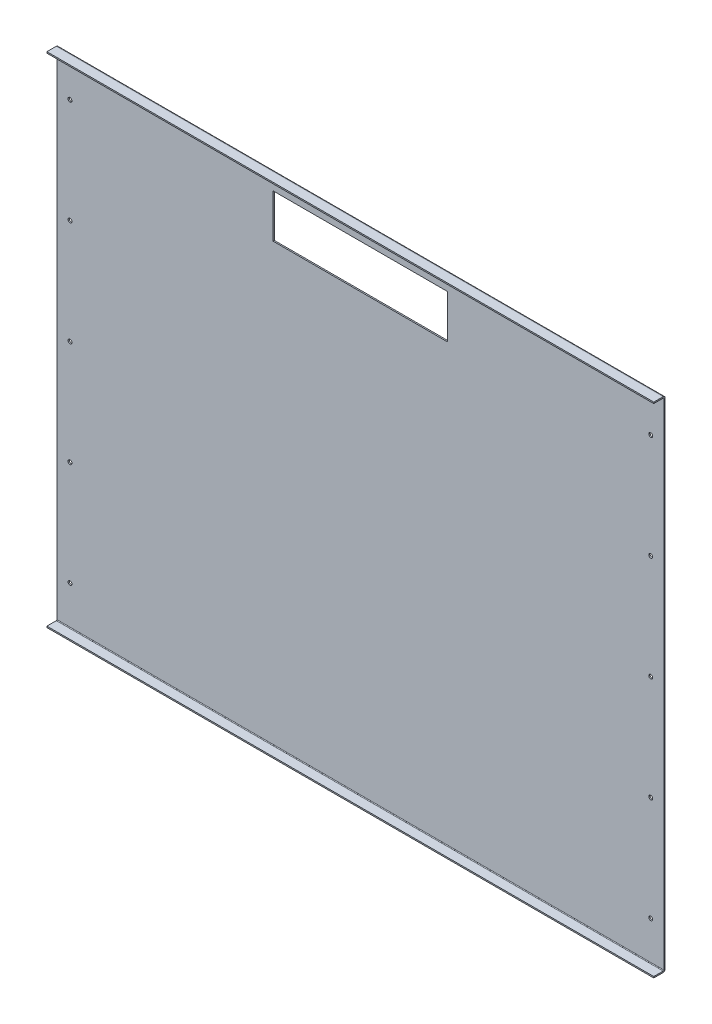
ISO-10303-21;
HEADER;
FILE_DESCRIPTION(('STEP AP214'),'2;1');
FILE_NAME('part.step','',(''),(''),'','','');
FILE_SCHEMA(('AUTOMOTIVE_DESIGN { 1 0 10303 214 1 1 1 1 }'));
ENDSEC;
DATA;
#1=APPLICATION_CONTEXT('core data for automotive mechanical design processes');
#2=APPLICATION_PROTOCOL_DEFINITION('international standard','automotive_design',2000,#1);
#3=PRODUCT_CONTEXT('',#1,'mechanical');
#4=PRODUCT('Part','Part','',(#3));
#5=PRODUCT_RELATED_PRODUCT_CATEGORY('part','',(#4));
#6=PRODUCT_DEFINITION_FORMATION('','',#4);
#7=PRODUCT_DEFINITION_CONTEXT('part definition',#1,'design');
#8=PRODUCT_DEFINITION('design','',#6,#7);
#9=PRODUCT_DEFINITION_SHAPE('','',#8);
#10=(LENGTH_UNIT() NAMED_UNIT(*) SI_UNIT(.MILLI.,.METRE.));
#11=(NAMED_UNIT(*) PLANE_ANGLE_UNIT() SI_UNIT($,.RADIAN.));
#12=(NAMED_UNIT(*) SI_UNIT($,.STERADIAN.) SOLID_ANGLE_UNIT());
#13=UNCERTAINTY_MEASURE_WITH_UNIT(LENGTH_MEASURE(1.E-05),#10,'distance_accuracy_value','');
#14=(GEOMETRIC_REPRESENTATION_CONTEXT(3) GLOBAL_UNCERTAINTY_ASSIGNED_CONTEXT((#13)) GLOBAL_UNIT_ASSIGNED_CONTEXT((#10,
#11,#12)) REPRESENTATION_CONTEXT('',''));
#15=CARTESIAN_POINT('',(0.,0.,0.));
#16=DIRECTION('',(0.,0.,1.));
#17=DIRECTION('',(1.,0.,0.));
#18=AXIS2_PLACEMENT_3D('',#15,#16,#17);
#19=CARTESIAN_POINT('',(0.,0.,-1.5));
#20=DIRECTION('',(0.,0.,-1.));
#21=DIRECTION('',(-1.,0.,0.));
#22=AXIS2_PLACEMENT_3D('',#19,#20,#21);
#23=PLANE('',#22);
#24=DIRECTION('',(0.,1.,0.));
#25=VECTOR('',#24,1.);
#26=CARTESIAN_POINT('',(100.,266.,-1.5));
#27=LINE('',#26,#25);
#28=CARTESIAN_POINT('',(100.,216.,-1.5));
#29=VERTEX_POINT('',#28);
#30=CARTESIAN_POINT('',(100.,266.,-1.5));
#31=VERTEX_POINT('',#30);
#32=EDGE_CURVE('E197',#29,#31,#27,.T.);
#33=ORIENTED_EDGE('',*,*,#32,.T.);
#34=DIRECTION('',(-1.,0.,0.));
#35=VECTOR('',#34,1.);
#36=CARTESIAN_POINT('',(-99.9999999999999,266.,-1.5));
#37=LINE('',#36,#35);
#38=CARTESIAN_POINT('',(-99.9999999999999,266.,-1.5));
#39=VERTEX_POINT('',#38);
#40=EDGE_CURVE('E206',#31,#39,#37,.T.);
#41=ORIENTED_EDGE('',*,*,#40,.T.);
#42=DIRECTION('',(0.,-1.,0.));
#43=VECTOR('',#42,1.);
#44=CARTESIAN_POINT('',(-99.9999999999999,266.,-1.5));
#45=LINE('',#44,#43);
#46=CARTESIAN_POINT('',(-99.9999999999999,216.,-1.5));
#47=VERTEX_POINT('',#46);
#48=EDGE_CURVE('E97',#39,#47,#45,.T.);
#49=ORIENTED_EDGE('',*,*,#48,.T.);
#50=DIRECTION('',(1.,0.,0.));
#51=VECTOR('',#50,1.);
#52=CARTESIAN_POINT('',(-99.9999999999999,216.,-1.5));
#53=LINE('',#52,#51);
#54=EDGE_CURVE('E203',#47,#29,#53,.T.);
#55=ORIENTED_EDGE('',*,*,#54,.T.);
#56=EDGE_LOOP('',(#33,#41,#49,#55));
#57=FACE_BOUND('',#56,.T.);
#58=CARTESIAN_POINT('',(-333.,-240.,-1.5));
#59=DIRECTION('',(0.,0.,1.));
#60=DIRECTION('',(-1.,0.,0.));
#61=AXIS2_PLACEMENT_3D('',#58,#59,#60);
#62=CIRCLE('',#61,2.24999999999995);
#63=CARTESIAN_POINT('',(-335.25,-240.,-1.5));
#64=VERTEX_POINT('',#63);
#65=EDGE_CURVE('E231',#64,#64,#62,.T.);
#66=ORIENTED_EDGE('',*,*,#65,.T.);
#67=EDGE_LOOP('',(#66));
#68=FACE_BOUND('',#67,.T.);
#69=CARTESIAN_POINT('',(333.,-240.,-1.5));
#70=DIRECTION('',(0.,0.,1.));
#71=DIRECTION('',(1.,0.,0.));
#72=AXIS2_PLACEMENT_3D('',#69,#70,#71);
#73=CIRCLE('',#72,2.24999999999995);
#74=CARTESIAN_POINT('',(335.25,-240.,-1.5));
#75=VERTEX_POINT('',#74);
#76=EDGE_CURVE('E237',#75,#75,#73,.T.);
#77=ORIENTED_EDGE('',*,*,#76,.T.);
#78=EDGE_LOOP('',(#77));
#79=FACE_BOUND('',#78,.T.);
#80=CARTESIAN_POINT('',(-333.,-120.,-1.5));
#81=DIRECTION('',(0.,0.,1.));
#82=DIRECTION('',(-1.,0.,0.));
#83=AXIS2_PLACEMENT_3D('',#80,#81,#82);
#84=CIRCLE('',#83,2.24999999999995);
#85=CARTESIAN_POINT('',(-335.25,-120.,-1.5));
#86=VERTEX_POINT('',#85);
#87=EDGE_CURVE('E243',#86,#86,#84,.T.);
#88=ORIENTED_EDGE('',*,*,#87,.T.);
#89=EDGE_LOOP('',(#88));
#90=FACE_BOUND('',#89,.T.);
#91=CARTESIAN_POINT('',(333.,-120.,-1.5));
#92=DIRECTION('',(0.,0.,1.));
#93=DIRECTION('',(1.,0.,0.));
#94=AXIS2_PLACEMENT_3D('',#91,#92,#93);
#95=CIRCLE('',#94,2.24999999999995);
#96=CARTESIAN_POINT('',(335.25,-120.,-1.5));
#97=VERTEX_POINT('',#96);
#98=EDGE_CURVE('E249',#97,#97,#95,.T.);
#99=ORIENTED_EDGE('',*,*,#98,.T.);
#100=EDGE_LOOP('',(#99));
#101=FACE_BOUND('',#100,.T.);
#102=CARTESIAN_POINT('',(-333.,240.,-1.5));
#103=DIRECTION('',(0.,0.,1.));
#104=DIRECTION('',(-1.,0.,0.));
#105=AXIS2_PLACEMENT_3D('',#102,#103,#104);
#106=CIRCLE('',#105,2.24999999999995);
#107=CARTESIAN_POINT('',(-335.25,240.,-1.5));
#108=VERTEX_POINT('',#107);
#109=EDGE_CURVE('E255',#108,#108,#106,.T.);
#110=ORIENTED_EDGE('',*,*,#109,.T.);
#111=EDGE_LOOP('',(#110));
#112=FACE_BOUND('',#111,.T.);
#113=CARTESIAN_POINT('',(333.,240.,-1.5));
#114=DIRECTION('',(0.,0.,1.));
#115=DIRECTION('',(1.,0.,0.));
#116=AXIS2_PLACEMENT_3D('',#113,#114,#115);
#117=CIRCLE('',#116,2.24999999999995);
#118=CARTESIAN_POINT('',(335.25,240.,-1.5));
#119=VERTEX_POINT('',#118);
#120=EDGE_CURVE('E261',#119,#119,#117,.T.);
#121=ORIENTED_EDGE('',*,*,#120,.T.);
#122=EDGE_LOOP('',(#121));
#123=FACE_BOUND('',#122,.T.);
#124=CARTESIAN_POINT('',(-333.,120.,-1.5));
#125=DIRECTION('',(0.,0.,1.));
#126=DIRECTION('',(-1.,0.,0.));
#127=AXIS2_PLACEMENT_3D('',#124,#125,#126);
#128=CIRCLE('',#127,2.24999999999995);
#129=CARTESIAN_POINT('',(-335.25,120.,-1.5));
#130=VERTEX_POINT('',#129);
#131=EDGE_CURVE('E267',#130,#130,#128,.T.);
#132=ORIENTED_EDGE('',*,*,#131,.T.);
#133=EDGE_LOOP('',(#132));
#134=FACE_BOUND('',#133,.T.);
#135=CARTESIAN_POINT('',(333.,120.,-1.5));
#136=DIRECTION('',(0.,0.,1.));
#137=DIRECTION('',(1.,0.,0.));
#138=AXIS2_PLACEMENT_3D('',#135,#136,#137);
#139=CIRCLE('',#138,2.24999999999995);
#140=CARTESIAN_POINT('',(335.25,120.,-1.5));
#141=VERTEX_POINT('',#140);
#142=EDGE_CURVE('E273',#141,#141,#139,.T.);
#143=ORIENTED_EDGE('',*,*,#142,.T.);
#144=EDGE_LOOP('',(#143));
#145=FACE_BOUND('',#144,.T.);
#146=CARTESIAN_POINT('',(-333.,0.,-1.5));
#147=DIRECTION('',(0.,0.,1.));
#148=DIRECTION('',(-1.,0.,0.));
#149=AXIS2_PLACEMENT_3D('',#146,#147,#148);
#150=CIRCLE('',#149,2.24999999999995);
#151=CARTESIAN_POINT('',(-335.25,0.,-1.5));
#152=VERTEX_POINT('',#151);
#153=EDGE_CURVE('E279',#152,#152,#150,.T.);
#154=ORIENTED_EDGE('',*,*,#153,.T.);
#155=EDGE_LOOP('',(#154));
#156=FACE_BOUND('',#155,.T.);
#157=CARTESIAN_POINT('',(333.,0.,-1.5));
#158=DIRECTION('',(0.,0.,1.));
#159=DIRECTION('',(1.,0.,0.));
#160=AXIS2_PLACEMENT_3D('',#157,#158,#159);
#161=CIRCLE('',#160,2.24999999999995);
#162=CARTESIAN_POINT('',(335.25,0.,-1.5));
#163=VERTEX_POINT('',#162);
#164=EDGE_CURVE('E285',#163,#163,#161,.T.);
#165=ORIENTED_EDGE('',*,*,#164,.T.);
#166=EDGE_LOOP('',(#165));
#167=FACE_BOUND('',#166,.T.);
#168=DIRECTION('',(0.,1.,0.));
#169=VECTOR('',#168,1.);
#170=CARTESIAN_POINT('',(348.,-286.,-1.5));
#171=LINE('',#170,#169);
#172=CARTESIAN_POINT('',(348.,-283.7634,-1.5));
#173=VERTEX_POINT('',#172);
#174=CARTESIAN_POINT('',(348.,283.7634,-1.5));
#175=VERTEX_POINT('',#174);
#176=EDGE_CURVE('E89',#173,#175,#171,.T.);
#177=ORIENTED_EDGE('',*,*,#176,.F.);
#178=DIRECTION('',(1.,0.,0.));
#179=VECTOR('',#178,1.);
#180=CARTESIAN_POINT('',(348.,-283.7634,-1.5));
#181=LINE('',#180,#179);
#182=CARTESIAN_POINT('',(-348.,-283.7634,-1.5));
#183=VERTEX_POINT('',#182);
#184=EDGE_CURVE('E322',#173,#183,#181,.F.);
#185=ORIENTED_EDGE('',*,*,#184,.T.);
#186=DIRECTION('',(0.,-1.,0.));
#187=VECTOR('',#186,1.);
#188=CARTESIAN_POINT('',(-348.,-286.,-1.5));
#189=LINE('',#188,#187);
#190=CARTESIAN_POINT('',(-348.,283.7634,-1.5));
#191=VERTEX_POINT('',#190);
#192=EDGE_CURVE('E13',#191,#183,#189,.T.);
#193=ORIENTED_EDGE('',*,*,#192,.F.);
#194=DIRECTION('',(-1.,0.,0.));
#195=VECTOR('',#194,1.);
#196=CARTESIAN_POINT('',(-348.,283.7634,-1.5));
#197=LINE('',#196,#195);
#198=EDGE_CURVE('E375',#191,#175,#197,.F.);
#199=ORIENTED_EDGE('',*,*,#198,.T.);
#200=EDGE_LOOP('',(#177,#185,#193,#199));
#201=FACE_BOUND('',#200,.T.);
#202=ADVANCED_FACE('F80',(#57,#68,#79,#90,#101,#112,#123,#134,#145,#156,#167,#201),#23,.T.);
#203=CARTESIAN_POINT('',(0.,0.,0.));
#204=DIRECTION('',(0.,0.,-1.));
#205=DIRECTION('',(-1.,0.,0.));
#206=AXIS2_PLACEMENT_3D('',#203,#204,#205);
#207=PLANE('',#206);
#208=DIRECTION('',(-1.,0.,0.));
#209=VECTOR('',#208,1.);
#210=CARTESIAN_POINT('',(-99.9999999999999,266.,0.));
#211=LINE('',#210,#209);
#212=CARTESIAN_POINT('',(100.,266.,0.));
#213=VERTEX_POINT('',#212);
#214=CARTESIAN_POINT('',(-99.9999999999999,266.,0.));
#215=VERTEX_POINT('',#214);
#216=EDGE_CURVE('E221',#213,#215,#211,.T.);
#217=ORIENTED_EDGE('',*,*,#216,.F.);
#218=DIRECTION('',(0.,1.,0.));
#219=VECTOR('',#218,1.);
#220=CARTESIAN_POINT('',(100.,266.,0.));
#221=LINE('',#220,#219);
#222=CARTESIAN_POINT('',(100.,216.,0.));
#223=VERTEX_POINT('',#222);
#224=EDGE_CURVE('E105',#223,#213,#221,.T.);
#225=ORIENTED_EDGE('',*,*,#224,.F.);
#226=DIRECTION('',(1.,0.,0.));
#227=VECTOR('',#226,1.);
#228=CARTESIAN_POINT('',(-99.9999999999999,216.,0.));
#229=LINE('',#228,#227);
#230=CARTESIAN_POINT('',(-99.9999999999999,216.,0.));
#231=VERTEX_POINT('',#230);
#232=EDGE_CURVE('E212',#231,#223,#229,.T.);
#233=ORIENTED_EDGE('',*,*,#232,.F.);
#234=DIRECTION('',(0.,-1.,0.));
#235=VECTOR('',#234,1.);
#236=CARTESIAN_POINT('',(-99.9999999999999,266.,0.));
#237=LINE('',#236,#235);
#238=EDGE_CURVE('E215',#215,#231,#237,.T.);
#239=ORIENTED_EDGE('',*,*,#238,.F.);
#240=EDGE_LOOP('',(#217,#225,#233,#239));
#241=FACE_BOUND('',#240,.T.);
#242=CARTESIAN_POINT('',(-333.,-240.,0.));
#243=DIRECTION('',(0.,0.,1.));
#244=DIRECTION('',(-1.,0.,0.));
#245=AXIS2_PLACEMENT_3D('',#242,#243,#244);
#246=CIRCLE('',#245,2.24999999999995);
#247=CARTESIAN_POINT('',(-335.25,-240.,0.));
#248=VERTEX_POINT('',#247);
#249=EDGE_CURVE('E227',#248,#248,#246,.T.);
#250=ORIENTED_EDGE('',*,*,#249,.F.);
#251=EDGE_LOOP('',(#250));
#252=FACE_BOUND('',#251,.T.);
#253=CARTESIAN_POINT('',(333.,-240.,0.));
#254=DIRECTION('',(0.,0.,1.));
#255=DIRECTION('',(1.,0.,0.));
#256=AXIS2_PLACEMENT_3D('',#253,#254,#255);
#257=CIRCLE('',#256,2.24999999999995);
#258=CARTESIAN_POINT('',(335.25,-240.,0.));
#259=VERTEX_POINT('',#258);
#260=EDGE_CURVE('E234',#259,#259,#257,.T.);
#261=ORIENTED_EDGE('',*,*,#260,.F.);
#262=EDGE_LOOP('',(#261));
#263=FACE_BOUND('',#262,.T.);
#264=CARTESIAN_POINT('',(-333.,-120.,0.));
#265=DIRECTION('',(0.,0.,1.));
#266=DIRECTION('',(-1.,0.,0.));
#267=AXIS2_PLACEMENT_3D('',#264,#265,#266);
#268=CIRCLE('',#267,2.24999999999995);
#269=CARTESIAN_POINT('',(-335.25,-120.,0.));
#270=VERTEX_POINT('',#269);
#271=EDGE_CURVE('E240',#270,#270,#268,.T.);
#272=ORIENTED_EDGE('',*,*,#271,.F.);
#273=EDGE_LOOP('',(#272));
#274=FACE_BOUND('',#273,.T.);
#275=CARTESIAN_POINT('',(333.,-120.,0.));
#276=DIRECTION('',(0.,0.,1.));
#277=DIRECTION('',(1.,0.,0.));
#278=AXIS2_PLACEMENT_3D('',#275,#276,#277);
#279=CIRCLE('',#278,2.24999999999995);
#280=CARTESIAN_POINT('',(335.25,-120.,0.));
#281=VERTEX_POINT('',#280);
#282=EDGE_CURVE('E246',#281,#281,#279,.T.);
#283=ORIENTED_EDGE('',*,*,#282,.F.);
#284=EDGE_LOOP('',(#283));
#285=FACE_BOUND('',#284,.T.);
#286=CARTESIAN_POINT('',(-333.,240.,0.));
#287=DIRECTION('',(0.,0.,1.));
#288=DIRECTION('',(-1.,0.,0.));
#289=AXIS2_PLACEMENT_3D('',#286,#287,#288);
#290=CIRCLE('',#289,2.24999999999995);
#291=CARTESIAN_POINT('',(-335.25,240.,0.));
#292=VERTEX_POINT('',#291);
#293=EDGE_CURVE('E252',#292,#292,#290,.T.);
#294=ORIENTED_EDGE('',*,*,#293,.F.);
#295=EDGE_LOOP('',(#294));
#296=FACE_BOUND('',#295,.T.);
#297=CARTESIAN_POINT('',(333.,240.,0.));
#298=DIRECTION('',(0.,0.,1.));
#299=DIRECTION('',(1.,0.,0.));
#300=AXIS2_PLACEMENT_3D('',#297,#298,#299);
#301=CIRCLE('',#300,2.24999999999995);
#302=CARTESIAN_POINT('',(335.25,240.,0.));
#303=VERTEX_POINT('',#302);
#304=EDGE_CURVE('E258',#303,#303,#301,.T.);
#305=ORIENTED_EDGE('',*,*,#304,.F.);
#306=EDGE_LOOP('',(#305));
#307=FACE_BOUND('',#306,.T.);
#308=CARTESIAN_POINT('',(-333.,120.,0.));
#309=DIRECTION('',(0.,0.,1.));
#310=DIRECTION('',(-1.,0.,0.));
#311=AXIS2_PLACEMENT_3D('',#308,#309,#310);
#312=CIRCLE('',#311,2.24999999999995);
#313=CARTESIAN_POINT('',(-335.25,120.,0.));
#314=VERTEX_POINT('',#313);
#315=EDGE_CURVE('E264',#314,#314,#312,.T.);
#316=ORIENTED_EDGE('',*,*,#315,.F.);
#317=EDGE_LOOP('',(#316));
#318=FACE_BOUND('',#317,.T.);
#319=CARTESIAN_POINT('',(333.,120.,0.));
#320=DIRECTION('',(0.,0.,1.));
#321=DIRECTION('',(1.,0.,0.));
#322=AXIS2_PLACEMENT_3D('',#319,#320,#321);
#323=CIRCLE('',#322,2.24999999999995);
#324=CARTESIAN_POINT('',(335.25,120.,0.));
#325=VERTEX_POINT('',#324);
#326=EDGE_CURVE('E270',#325,#325,#323,.T.);
#327=ORIENTED_EDGE('',*,*,#326,.F.);
#328=EDGE_LOOP('',(#327));
#329=FACE_BOUND('',#328,.T.);
#330=CARTESIAN_POINT('',(-333.,0.,0.));
#331=DIRECTION('',(0.,0.,1.));
#332=DIRECTION('',(-1.,0.,0.));
#333=AXIS2_PLACEMENT_3D('',#330,#331,#332);
#334=CIRCLE('',#333,2.24999999999995);
#335=CARTESIAN_POINT('',(-335.25,0.,0.));
#336=VERTEX_POINT('',#335);
#337=EDGE_CURVE('E276',#336,#336,#334,.T.);
#338=ORIENTED_EDGE('',*,*,#337,.F.);
#339=EDGE_LOOP('',(#338));
#340=FACE_BOUND('',#339,.T.);
#341=CARTESIAN_POINT('',(333.,0.,0.));
#342=DIRECTION('',(0.,0.,1.));
#343=DIRECTION('',(1.,0.,0.));
#344=AXIS2_PLACEMENT_3D('',#341,#342,#343);
#345=CIRCLE('',#344,2.24999999999995);
#346=CARTESIAN_POINT('',(335.25,0.,0.));
#347=VERTEX_POINT('',#346);
#348=EDGE_CURVE('E282',#347,#347,#345,.T.);
#349=ORIENTED_EDGE('',*,*,#348,.F.);
#350=EDGE_LOOP('',(#349));
#351=FACE_BOUND('',#350,.T.);
#352=DIRECTION('',(1.,0.,0.));
#353=VECTOR('',#352,1.);
#354=CARTESIAN_POINT('',(348.,-283.7634,0.));
#355=LINE('',#354,#353);
#356=CARTESIAN_POINT('',(348.,-283.7634,0.));
#357=VERTEX_POINT('',#356);
#358=CARTESIAN_POINT('',(-348.,-283.7634,0.));
#359=VERTEX_POINT('',#358);
#360=EDGE_CURVE('E335',#357,#359,#355,.F.);
#361=ORIENTED_EDGE('',*,*,#360,.F.);
#362=DIRECTION('',(0.,1.,0.));
#363=VECTOR('',#362,1.);
#364=CARTESIAN_POINT('',(348.,-286.,0.));
#365=LINE('',#364,#363);
#366=CARTESIAN_POINT('',(348.,283.7634,0.));
#367=VERTEX_POINT('',#366);
#368=EDGE_CURVE('E395',#357,#367,#365,.T.);
#369=ORIENTED_EDGE('',*,*,#368,.T.);
#370=DIRECTION('',(-1.,0.,0.));
#371=VECTOR('',#370,1.);
#372=CARTESIAN_POINT('',(-348.,283.7634,0.));
#373=LINE('',#372,#371);
#374=CARTESIAN_POINT('',(-348.,283.7634,0.));
#375=VERTEX_POINT('',#374);
#376=EDGE_CURVE('E388',#375,#367,#373,.F.);
#377=ORIENTED_EDGE('',*,*,#376,.F.);
#378=DIRECTION('',(0.,-1.,0.));
#379=VECTOR('',#378,1.);
#380=CARTESIAN_POINT('',(-348.,-286.,0.));
#381=LINE('',#380,#379);
#382=EDGE_CURVE('E84',#375,#359,#381,.T.);
#383=ORIENTED_EDGE('',*,*,#382,.T.);
#384=EDGE_LOOP('',(#361,#369,#377,#383));
#385=FACE_BOUND('',#384,.T.);
#386=ADVANCED_FACE('F407',(#241,#252,#263,#274,#285,#296,#307,#318,#329,#340,#351,#385),#207,.F.);
#387=CARTESIAN_POINT('',(348.,-286.,-1.5));
#388=DIRECTION('',(1.,0.,0.));
#389=DIRECTION('',(0.,0.,-1.));
#390=AXIS2_PLACEMENT_3D('',#387,#388,#389);
#391=PLANE('',#390);
#392=ORIENTED_EDGE('',*,*,#368,.F.);
#393=DIRECTION('',(0.,0.,-1.));
#394=VECTOR('',#393,1.);
#395=CARTESIAN_POINT('',(348.,-283.7634,0.));
#396=LINE('',#395,#394);
#397=EDGE_CURVE('E329',#357,#173,#396,.T.);
#398=ORIENTED_EDGE('',*,*,#397,.T.);
#399=ORIENTED_EDGE('',*,*,#176,.T.);
#400=DIRECTION('',(0.,0.,-1.));
#401=VECTOR('',#400,1.);
#402=CARTESIAN_POINT('',(348.,283.7634,0.));
#403=LINE('',#402,#401);
#404=EDGE_CURVE('E392',#367,#175,#403,.T.);
#405=ORIENTED_EDGE('',*,*,#404,.F.);
#406=EDGE_LOOP('',(#392,#398,#399,#405));
#407=FACE_BOUND('',#406,.T.);
#408=ADVANCED_FACE('F82',(#407),#391,.T.);
#409=CARTESIAN_POINT('',(-348.,-286.,-1.5));
#410=DIRECTION('',(-1.,0.,0.));
#411=DIRECTION('',(0.,0.,1.));
#412=AXIS2_PLACEMENT_3D('',#409,#410,#411);
#413=PLANE('',#412);
#414=DIRECTION('',(0.,0.,-1.));
#415=VECTOR('',#414,1.);
#416=CARTESIAN_POINT('',(-348.,-283.7634,0.));
#417=LINE('',#416,#415);
#418=EDGE_CURVE('E339',#359,#183,#417,.T.);
#419=ORIENTED_EDGE('',*,*,#418,.F.);
#420=ORIENTED_EDGE('',*,*,#382,.F.);
#421=DIRECTION('',(0.,0.,-1.));
#422=VECTOR('',#421,1.);
#423=CARTESIAN_POINT('',(-348.,283.7634,0.));
#424=LINE('',#423,#422);
#425=EDGE_CURVE('E382',#375,#191,#424,.T.);
#426=ORIENTED_EDGE('',*,*,#425,.T.);
#427=ORIENTED_EDGE('',*,*,#192,.T.);
#428=EDGE_LOOP('',(#419,#420,#426,#427));
#429=FACE_BOUND('',#428,.T.);
#430=ADVANCED_FACE('F410',(#429),#413,.T.);
#431=CARTESIAN_POINT('',(348.,283.7634,0.73659999999998));
#432=DIRECTION('',(1.,0.,0.));
#433=DIRECTION('',(0.,0.,-1.));
#434=AXIS2_PLACEMENT_3D('',#431,#432,#433);
#435=PLANE('',#434);
#436=DIRECTION('',(0.,-1.,0.));
#437=VECTOR('',#436,1.);
#438=CARTESIAN_POINT('',(348.,286.,0.736599999999969));
#439=LINE('',#438,#437);
#440=CARTESIAN_POINT('',(348.,284.5,0.736599999999976));
#441=VERTEX_POINT('',#440);
#442=CARTESIAN_POINT('',(348.,286.,0.736599999999969));
#443=VERTEX_POINT('',#442);
#444=EDGE_CURVE('E342',#441,#443,#439,.F.);
#445=ORIENTED_EDGE('',*,*,#444,.F.);
#446=CARTESIAN_POINT('',(348.,283.7634,0.73659999999998));
#447=DIRECTION('',(-1.,0.,0.));
#448=DIRECTION('',(0.,0.,1.));
#449=AXIS2_PLACEMENT_3D('',#446,#447,#448);
#450=CIRCLE('',#449,0.736599999999976);
#451=EDGE_CURVE('E385',#367,#441,#450,.F.);
#452=ORIENTED_EDGE('',*,*,#451,.F.);
#453=ORIENTED_EDGE('',*,*,#404,.T.);
#454=CARTESIAN_POINT('',(348.,283.7634,0.73659999999998));
#455=DIRECTION('',(-1.,0.,0.));
#456=DIRECTION('',(0.,0.,1.));
#457=AXIS2_PLACEMENT_3D('',#454,#455,#456);
#458=CIRCLE('',#457,2.23659999999998);
#459=EDGE_CURVE('E378',#175,#443,#458,.F.);
#460=ORIENTED_EDGE('',*,*,#459,.T.);
#461=EDGE_LOOP('',(#445,#452,#453,#460));
#462=FACE_BOUND('',#461,.T.);
#463=ADVANCED_FACE('F426',(#462),#435,.T.);
#464=CARTESIAN_POINT('',(-348.,283.7634,0.73659999999998));
#465=DIRECTION('',(1.,0.,0.));
#466=DIRECTION('',(0.,0.,-1.));
#467=AXIS2_PLACEMENT_3D('',#464,#465,#466);
#468=PLANE('',#467);
#469=CARTESIAN_POINT('',(-348.,283.7634,0.73659999999998));
#470=DIRECTION('',(-1.,0.,0.));
#471=DIRECTION('',(0.,0.,1.));
#472=AXIS2_PLACEMENT_3D('',#469,#470,#471);
#473=CIRCLE('',#472,0.736599999999976);
#474=CARTESIAN_POINT('',(-348.,284.5,0.736599999999976));
#475=VERTEX_POINT('',#474);
#476=EDGE_CURVE('E348',#475,#375,#473,.T.);
#477=ORIENTED_EDGE('',*,*,#476,.F.);
#478=DIRECTION('',(0.,-1.,0.));
#479=VECTOR('',#478,1.);
#480=CARTESIAN_POINT('',(-348.,284.5,0.736599999999976));
#481=LINE('',#480,#479);
#482=CARTESIAN_POINT('',(-348.,286.,0.736599999999969));
#483=VERTEX_POINT('',#482);
#484=EDGE_CURVE('E368',#475,#483,#481,.F.);
#485=ORIENTED_EDGE('',*,*,#484,.T.);
#486=CARTESIAN_POINT('',(-348.,283.7634,0.73659999999998));
#487=DIRECTION('',(-1.,0.,0.));
#488=DIRECTION('',(0.,0.,1.));
#489=AXIS2_PLACEMENT_3D('',#486,#487,#488);
#490=CIRCLE('',#489,2.23659999999998);
#491=EDGE_CURVE('E379',#483,#191,#490,.T.);
#492=ORIENTED_EDGE('',*,*,#491,.T.);
#493=ORIENTED_EDGE('',*,*,#425,.F.);
#494=EDGE_LOOP('',(#477,#485,#492,#493));
#495=FACE_BOUND('',#494,.T.);
#496=ADVANCED_FACE('F450',(#495),#468,.F.);
#497=CARTESIAN_POINT('',(-348.,283.7634,0.73659999999998));
#498=DIRECTION('',(-1.,0.,0.));
#499=DIRECTION('',(0.,1.,0.));
#500=AXIS2_PLACEMENT_3D('',#497,#498,#499);
#501=CYLINDRICAL_SURFACE('',#500,2.23659999999998);
#502=ORIENTED_EDGE('',*,*,#198,.F.);
#503=ORIENTED_EDGE('',*,*,#491,.F.);
#504=DIRECTION('',(-1.,0.,0.));
#505=VECTOR('',#504,1.);
#506=CARTESIAN_POINT('',(348.,286.,0.736599999999969));
#507=LINE('',#506,#505);
#508=EDGE_CURVE('E366',#483,#443,#507,.F.);
#509=ORIENTED_EDGE('',*,*,#508,.T.);
#510=ORIENTED_EDGE('',*,*,#459,.F.);
#511=EDGE_LOOP('',(#502,#503,#509,#510));
#512=FACE_BOUND('',#511,.T.);
#513=ADVANCED_FACE('F454',(#512),#501,.T.);
#514=CARTESIAN_POINT('',(-348.,283.7634,0.73659999999998));
#515=DIRECTION('',(-1.,0.,0.));
#516=DIRECTION('',(0.,1.,0.));
#517=AXIS2_PLACEMENT_3D('',#514,#515,#516);
#518=CYLINDRICAL_SURFACE('',#517,0.736599999999976);
#519=ORIENTED_EDGE('',*,*,#376,.T.);
#520=ORIENTED_EDGE('',*,*,#451,.T.);
#521=DIRECTION('',(-1.,0.,0.));
#522=VECTOR('',#521,1.);
#523=CARTESIAN_POINT('',(348.,284.5,0.736599999999976));
#524=LINE('',#523,#522);
#525=EDGE_CURVE('E371',#441,#475,#524,.T.);
#526=ORIENTED_EDGE('',*,*,#525,.T.);
#527=ORIENTED_EDGE('',*,*,#476,.T.);
#528=EDGE_LOOP('',(#519,#520,#526,#527));
#529=FACE_BOUND('',#528,.T.);
#530=ADVANCED_FACE('F429',(#529),#518,.F.);
#531=CARTESIAN_POINT('',(-348.,286.,11.5));
#532=DIRECTION('',(1.,0.,0.));
#533=DIRECTION('',(0.,0.,-1.));
#534=AXIS2_PLACEMENT_3D('',#531,#532,#533);
#535=PLANE('',#534);
#536=ORIENTED_EDGE('',*,*,#484,.F.);
#537=DIRECTION('',(0.,0.,-1.));
#538=VECTOR('',#537,1.);
#539=CARTESIAN_POINT('',(-348.,284.5,11.5));
#540=LINE('',#539,#538);
#541=CARTESIAN_POINT('',(-348.,284.5,11.5));
#542=VERTEX_POINT('',#541);
#543=EDGE_CURVE('E364',#475,#542,#540,.F.);
#544=ORIENTED_EDGE('',*,*,#543,.T.);
#545=DIRECTION('',(0.,-1.,0.));
#546=VECTOR('',#545,1.);
#547=CARTESIAN_POINT('',(-348.,286.,11.5));
#548=LINE('',#547,#546);
#549=CARTESIAN_POINT('',(-348.,286.,11.5));
#550=VERTEX_POINT('',#549);
#551=EDGE_CURVE('E345',#550,#542,#548,.T.);
#552=ORIENTED_EDGE('',*,*,#551,.F.);
#553=DIRECTION('',(0.,0.,1.));
#554=VECTOR('',#553,1.);
#555=CARTESIAN_POINT('',(-348.,286.,-1.3857754178465E-12));
#556=LINE('',#555,#554);
#557=EDGE_CURVE('E357',#483,#550,#556,.T.);
#558=ORIENTED_EDGE('',*,*,#557,.F.);
#559=EDGE_LOOP('',(#536,#544,#552,#558));
#560=FACE_BOUND('',#559,.T.);
#561=ADVANCED_FACE('F447',(#560),#535,.F.);
#562=CARTESIAN_POINT('',(348.,286.,0.));
#563=DIRECTION('',(-1.,0.,0.));
#564=DIRECTION('',(0.,0.,1.));
#565=AXIS2_PLACEMENT_3D('',#562,#563,#564);
#566=PLANE('',#565);
#567=ORIENTED_EDGE('',*,*,#444,.T.);
#568=DIRECTION('',(0.,0.,-1.));
#569=VECTOR('',#568,1.);
#570=CARTESIAN_POINT('',(348.,286.,-1.3857754178465E-12));
#571=LINE('',#570,#569);
#572=CARTESIAN_POINT('',(348.,286.,11.5));
#573=VERTEX_POINT('',#572);
#574=EDGE_CURVE('E352',#573,#443,#571,.T.);
#575=ORIENTED_EDGE('',*,*,#574,.F.);
#576=DIRECTION('',(0.,-1.,0.));
#577=VECTOR('',#576,1.);
#578=CARTESIAN_POINT('',(348.,286.,11.5));
#579=LINE('',#578,#577);
#580=CARTESIAN_POINT('',(348.,284.5,11.5));
#581=VERTEX_POINT('',#580);
#582=EDGE_CURVE('E349',#573,#581,#579,.T.);
#583=ORIENTED_EDGE('',*,*,#582,.T.);
#584=DIRECTION('',(0.,0.,1.));
#585=VECTOR('',#584,1.);
#586=CARTESIAN_POINT('',(348.,284.5,0.));
#587=LINE('',#586,#585);
#588=EDGE_CURVE('E359',#581,#441,#587,.F.);
#589=ORIENTED_EDGE('',*,*,#588,.T.);
#590=EDGE_LOOP('',(#567,#575,#583,#589));
#591=FACE_BOUND('',#590,.T.);
#592=ADVANCED_FACE('F437',(#591),#566,.F.);
#593=CARTESIAN_POINT('',(0.,286.,-1.3857754178465E-12));
#594=DIRECTION('',(0.,-1.,0.));
#595=DIRECTION('',(0.,0.,-1.));
#596=AXIS2_PLACEMENT_3D('',#593,#594,#595);
#597=PLANE('',#596);
#598=ORIENTED_EDGE('',*,*,#508,.F.);
#599=ORIENTED_EDGE('',*,*,#557,.T.);
#600=DIRECTION('',(1.,0.,0.));
#601=VECTOR('',#600,1.);
#602=CARTESIAN_POINT('',(0.,286.,11.5));
#603=LINE('',#602,#601);
#604=EDGE_CURVE('E355',#550,#573,#603,.T.);
#605=ORIENTED_EDGE('',*,*,#604,.T.);
#606=ORIENTED_EDGE('',*,*,#574,.T.);
#607=EDGE_LOOP('',(#598,#599,#605,#606));
#608=FACE_BOUND('',#607,.T.);
#609=ADVANCED_FACE('F452',(#608),#597,.F.);
#610=CARTESIAN_POINT('',(0.,284.5,-1.38053819583824E-12));
#611=DIRECTION('',(0.,-1.,0.));
#612=DIRECTION('',(0.,0.,-1.));
#613=AXIS2_PLACEMENT_3D('',#610,#611,#612);
#614=PLANE('',#613);
#615=ORIENTED_EDGE('',*,*,#543,.F.);
#616=ORIENTED_EDGE('',*,*,#525,.F.);
#617=ORIENTED_EDGE('',*,*,#588,.F.);
#618=DIRECTION('',(-1.,0.,0.));
#619=VECTOR('',#618,1.);
#620=CARTESIAN_POINT('',(348.,284.5,11.5));
#621=LINE('',#620,#619);
#622=EDGE_CURVE('E362',#542,#581,#621,.F.);
#623=ORIENTED_EDGE('',*,*,#622,.F.);
#624=EDGE_LOOP('',(#615,#616,#617,#623));
#625=FACE_BOUND('',#624,.T.);
#626=ADVANCED_FACE('F434',(#625),#614,.T.);
#627=CARTESIAN_POINT('',(348.,286.,11.5));
#628=DIRECTION('',(0.,0.,-1.));
#629=DIRECTION('',(0.,1.,0.));
#630=AXIS2_PLACEMENT_3D('',#627,#628,#629);
#631=PLANE('',#630);
#632=ORIENTED_EDGE('',*,*,#622,.T.);
#633=ORIENTED_EDGE('',*,*,#582,.F.);
#634=ORIENTED_EDGE('',*,*,#604,.F.);
#635=ORIENTED_EDGE('',*,*,#551,.T.);
#636=EDGE_LOOP('',(#632,#633,#634,#635));
#637=FACE_BOUND('',#636,.T.);
#638=ADVANCED_FACE('F442',(#637),#631,.F.);
#639=CARTESIAN_POINT('',(-348.,-283.7634,0.73659999999998));
#640=DIRECTION('',(-1.,0.,0.));
#641=DIRECTION('',(0.,0.,1.));
#642=AXIS2_PLACEMENT_3D('',#639,#640,#641);
#643=PLANE('',#642);
#644=DIRECTION('',(0.,1.,0.));
#645=VECTOR('',#644,1.);
#646=CARTESIAN_POINT('',(-348.,-286.,0.736599999999969));
#647=LINE('',#646,#645);
#648=CARTESIAN_POINT('',(-348.,-284.5,0.736599999999976));
#649=VERTEX_POINT('',#648);
#650=CARTESIAN_POINT('',(-348.,-286.,0.736599999999969));
#651=VERTEX_POINT('',#650);
#652=EDGE_CURVE('E288',#649,#651,#647,.F.);
#653=ORIENTED_EDGE('',*,*,#652,.F.);
#654=CARTESIAN_POINT('',(-348.,-283.7634,0.73659999999998));
#655=DIRECTION('',(1.,0.,0.));
#656=DIRECTION('',(0.,0.,-1.));
#657=AXIS2_PLACEMENT_3D('',#654,#655,#656);
#658=CIRCLE('',#657,0.736599999999976);
#659=EDGE_CURVE('E332',#359,#649,#658,.F.);
#660=ORIENTED_EDGE('',*,*,#659,.F.);
#661=ORIENTED_EDGE('',*,*,#418,.T.);
#662=CARTESIAN_POINT('',(-348.,-283.7634,0.73659999999998));
#663=DIRECTION('',(1.,0.,0.));
#664=DIRECTION('',(0.,0.,-1.));
#665=AXIS2_PLACEMENT_3D('',#662,#663,#664);
#666=CIRCLE('',#665,2.23659999999998);
#667=EDGE_CURVE('E325',#183,#651,#666,.F.);
#668=ORIENTED_EDGE('',*,*,#667,.T.);
#669=EDGE_LOOP('',(#653,#660,#661,#668));
#670=FACE_BOUND('',#669,.T.);
#671=ADVANCED_FACE('F414',(#670),#643,.T.);
#672=CARTESIAN_POINT('',(348.,-283.7634,0.73659999999998));
#673=DIRECTION('',(-1.,0.,0.));
#674=DIRECTION('',(0.,0.,1.));
#675=AXIS2_PLACEMENT_3D('',#672,#673,#674);
#676=PLANE('',#675);
#677=CARTESIAN_POINT('',(348.,-283.7634,0.73659999999998));
#678=DIRECTION('',(1.,0.,0.));
#679=DIRECTION('',(0.,0.,-1.));
#680=AXIS2_PLACEMENT_3D('',#677,#678,#679);
#681=CIRCLE('',#680,0.736599999999976);
#682=CARTESIAN_POINT('',(348.,-284.5,0.736599999999976));
#683=VERTEX_POINT('',#682);
#684=EDGE_CURVE('E294',#683,#357,#681,.T.);
#685=ORIENTED_EDGE('',*,*,#684,.F.);
#686=DIRECTION('',(0.,1.,0.));
#687=VECTOR('',#686,1.);
#688=CARTESIAN_POINT('',(348.,-284.5,0.736599999999976));
#689=LINE('',#688,#687);
#690=CARTESIAN_POINT('',(348.,-286.,0.736599999999969));
#691=VERTEX_POINT('',#690);
#692=EDGE_CURVE('E315',#683,#691,#689,.F.);
#693=ORIENTED_EDGE('',*,*,#692,.T.);
#694=CARTESIAN_POINT('',(348.,-283.7634,0.73659999999998));
#695=DIRECTION('',(1.,0.,0.));
#696=DIRECTION('',(0.,0.,-1.));
#697=AXIS2_PLACEMENT_3D('',#694,#695,#696);
#698=CIRCLE('',#697,2.23659999999998);
#699=EDGE_CURVE('E326',#691,#173,#698,.T.);
#700=ORIENTED_EDGE('',*,*,#699,.T.);
#701=ORIENTED_EDGE('',*,*,#397,.F.);
#702=EDGE_LOOP('',(#685,#693,#700,#701));
#703=FACE_BOUND('',#702,.T.);
#704=ADVANCED_FACE('F421',(#703),#676,.F.);
#705=CARTESIAN_POINT('',(348.,-283.7634,0.73659999999998));
#706=DIRECTION('',(1.,0.,0.));
#707=DIRECTION('',(0.,-1.,0.));
#708=AXIS2_PLACEMENT_3D('',#705,#706,#707);
#709=CYLINDRICAL_SURFACE('',#708,2.23659999999998);
#710=ORIENTED_EDGE('',*,*,#184,.F.);
#711=ORIENTED_EDGE('',*,*,#699,.F.);
#712=DIRECTION('',(1.,0.,0.));
#713=VECTOR('',#712,1.);
#714=CARTESIAN_POINT('',(0.,-286.,0.736599999999969));
#715=LINE('',#714,#713);
#716=EDGE_CURVE('E312',#651,#691,#715,.T.);
#717=ORIENTED_EDGE('',*,*,#716,.F.);
#718=ORIENTED_EDGE('',*,*,#667,.F.);
#719=EDGE_LOOP('',(#710,#711,#717,#718));
#720=FACE_BOUND('',#719,.T.);
#721=ADVANCED_FACE('F418',(#720),#709,.T.);
#722=CARTESIAN_POINT('',(348.,-283.7634,0.73659999999998));
#723=DIRECTION('',(1.,0.,0.));
#724=DIRECTION('',(0.,-1.,0.));
#725=AXIS2_PLACEMENT_3D('',#722,#723,#724);
#726=CYLINDRICAL_SURFACE('',#725,0.736599999999976);
#727=ORIENTED_EDGE('',*,*,#360,.T.);
#728=ORIENTED_EDGE('',*,*,#659,.T.);
#729=DIRECTION('',(-1.,0.,0.));
#730=VECTOR('',#729,1.);
#731=CARTESIAN_POINT('',(-348.,-284.5,0.736599999999976));
#732=LINE('',#731,#730);
#733=EDGE_CURVE('E318',#649,#683,#732,.F.);
#734=ORIENTED_EDGE('',*,*,#733,.T.);
#735=ORIENTED_EDGE('',*,*,#684,.T.);
#736=EDGE_LOOP('',(#727,#728,#734,#735));
#737=FACE_BOUND('',#736,.T.);
#738=ADVANCED_FACE('F680',(#737),#726,.F.);
#739=CARTESIAN_POINT('',(348.,-286.,0.));
#740=DIRECTION('',(-1.,0.,0.));
#741=DIRECTION('',(0.,0.,1.));
#742=AXIS2_PLACEMENT_3D('',#739,#740,#741);
#743=PLANE('',#742);
#744=ORIENTED_EDGE('',*,*,#692,.F.);
#745=DIRECTION('',(0.,0.,1.));
#746=VECTOR('',#745,1.);
#747=CARTESIAN_POINT('',(348.,-284.5,0.));
#748=LINE('',#747,#746);
#749=CARTESIAN_POINT('',(348.,-284.5,11.5));
#750=VERTEX_POINT('',#749);
#751=EDGE_CURVE('E310',#683,#750,#748,.T.);
#752=ORIENTED_EDGE('',*,*,#751,.T.);
#753=DIRECTION('',(0.,1.,0.));
#754=VECTOR('',#753,1.);
#755=CARTESIAN_POINT('',(348.,-286.,11.5));
#756=LINE('',#755,#754);
#757=CARTESIAN_POINT('',(348.,-286.,11.5));
#758=VERTEX_POINT('',#757);
#759=EDGE_CURVE('E291',#758,#750,#756,.T.);
#760=ORIENTED_EDGE('',*,*,#759,.F.);
#761=DIRECTION('',(0.,0.,-1.));
#762=VECTOR('',#761,1.);
#763=CARTESIAN_POINT('',(348.,-286.,-1.3857754178465E-12));
#764=LINE('',#763,#762);
#765=EDGE_CURVE('E303',#691,#758,#764,.F.);
#766=ORIENTED_EDGE('',*,*,#765,.F.);
#767=EDGE_LOOP('',(#744,#752,#760,#766));
#768=FACE_BOUND('',#767,.T.);
#769=ADVANCED_FACE('F670',(#768),#743,.F.);
#770=CARTESIAN_POINT('',(-348.,-286.,11.4999999999999));
#771=DIRECTION('',(1.,0.,0.));
#772=DIRECTION('',(0.,0.,-1.));
#773=AXIS2_PLACEMENT_3D('',#770,#771,#772);
#774=PLANE('',#773);
#775=ORIENTED_EDGE('',*,*,#652,.T.);
#776=DIRECTION('',(0.,0.,1.));
#777=VECTOR('',#776,1.);
#778=CARTESIAN_POINT('',(-348.,-286.,-1.3857754178465E-12));
#779=LINE('',#778,#777);
#780=CARTESIAN_POINT('',(-348.,-286.,11.4999999999999));
#781=VERTEX_POINT('',#780);
#782=EDGE_CURVE('E298',#781,#651,#779,.F.);
#783=ORIENTED_EDGE('',*,*,#782,.F.);
#784=DIRECTION('',(0.,1.,0.));
#785=VECTOR('',#784,1.);
#786=CARTESIAN_POINT('',(-348.,-286.,11.4999999999999));
#787=LINE('',#786,#785);
#788=CARTESIAN_POINT('',(-348.,-284.5,11.4999999999999));
#789=VERTEX_POINT('',#788);
#790=EDGE_CURVE('E295',#781,#789,#787,.T.);
#791=ORIENTED_EDGE('',*,*,#790,.T.);
#792=DIRECTION('',(0.,0.,-1.));
#793=VECTOR('',#792,1.);
#794=CARTESIAN_POINT('',(-348.,-284.5,11.4999999999999));
#795=LINE('',#794,#793);
#796=EDGE_CURVE('E305',#789,#649,#795,.T.);
#797=ORIENTED_EDGE('',*,*,#796,.T.);
#798=EDGE_LOOP('',(#775,#783,#791,#797));
#799=FACE_BOUND('',#798,.T.);
#800=ADVANCED_FACE('F660',(#799),#774,.F.);
#801=CARTESIAN_POINT('',(0.,-286.,-1.3857754178465E-12));
#802=DIRECTION('',(0.,-1.,0.));
#803=DIRECTION('',(0.,0.,-1.));
#804=AXIS2_PLACEMENT_3D('',#801,#802,#803);
#805=PLANE('',#804);
#806=ORIENTED_EDGE('',*,*,#782,.T.);
#807=ORIENTED_EDGE('',*,*,#716,.T.);
#808=ORIENTED_EDGE('',*,*,#765,.T.);
#809=DIRECTION('',(1.,0.,0.));
#810=VECTOR('',#809,1.);
#811=CARTESIAN_POINT('',(0.,-286.,11.5));
#812=LINE('',#811,#810);
#813=EDGE_CURVE('E301',#758,#781,#812,.F.);
#814=ORIENTED_EDGE('',*,*,#813,.T.);
#815=EDGE_LOOP('',(#806,#807,#808,#814));
#816=FACE_BOUND('',#815,.T.);
#817=ADVANCED_FACE('F650',(#816),#805,.T.);
#818=CARTESIAN_POINT('',(0.,-284.5,-1.38053819583824E-12));
#819=DIRECTION('',(0.,-1.,0.));
#820=DIRECTION('',(0.,0.,-1.));
#821=AXIS2_PLACEMENT_3D('',#818,#819,#820);
#822=PLANE('',#821);
#823=ORIENTED_EDGE('',*,*,#733,.F.);
#824=ORIENTED_EDGE('',*,*,#796,.F.);
#825=DIRECTION('',(-1.,0.,0.));
#826=VECTOR('',#825,1.);
#827=CARTESIAN_POINT('',(348.,-284.5,11.5));
#828=LINE('',#827,#826);
#829=EDGE_CURVE('E308',#750,#789,#828,.T.);
#830=ORIENTED_EDGE('',*,*,#829,.F.);
#831=ORIENTED_EDGE('',*,*,#751,.F.);
#832=EDGE_LOOP('',(#823,#824,#830,#831));
#833=FACE_BOUND('',#832,.T.);
#834=ADVANCED_FACE('F640',(#833),#822,.F.);
#835=CARTESIAN_POINT('',(348.,-286.,11.5));
#836=DIRECTION('',(0.,0.,-1.));
#837=DIRECTION('',(0.,1.,0.));
#838=AXIS2_PLACEMENT_3D('',#835,#836,#837);
#839=PLANE('',#838);
#840=ORIENTED_EDGE('',*,*,#829,.T.);
#841=ORIENTED_EDGE('',*,*,#790,.F.);
#842=ORIENTED_EDGE('',*,*,#813,.F.);
#843=ORIENTED_EDGE('',*,*,#759,.T.);
#844=EDGE_LOOP('',(#840,#841,#842,#843));
#845=FACE_BOUND('',#844,.T.);
#846=ADVANCED_FACE('F630',(#845),#839,.F.);
#847=CARTESIAN_POINT('',(333.,0.,-1.5));
#848=DIRECTION('',(0.,0.,1.));
#849=DIRECTION('',(1.,0.,0.));
#850=AXIS2_PLACEMENT_3D('',#847,#848,#849);
#851=CYLINDRICAL_SURFACE('',#850,2.24999999999995);
#852=ORIENTED_EDGE('',*,*,#164,.F.);
#853=EDGE_LOOP('',(#852));
#854=FACE_BOUND('',#853,.T.);
#855=ORIENTED_EDGE('',*,*,#348,.T.);
#856=EDGE_LOOP('',(#855));
#857=FACE_BOUND('',#856,.T.);
#858=ADVANCED_FACE('F620',(#854,#857),#851,.F.);
#859=CARTESIAN_POINT('',(-333.,0.,-1.5));
#860=DIRECTION('',(0.,0.,1.));
#861=DIRECTION('',(1.,0.,0.));
#862=AXIS2_PLACEMENT_3D('',#859,#860,#861);
#863=CYLINDRICAL_SURFACE('',#862,2.24999999999995);
#864=ORIENTED_EDGE('',*,*,#153,.F.);
#865=EDGE_LOOP('',(#864));
#866=FACE_BOUND('',#865,.T.);
#867=ORIENTED_EDGE('',*,*,#337,.T.);
#868=EDGE_LOOP('',(#867));
#869=FACE_BOUND('',#868,.T.);
#870=ADVANCED_FACE('F610',(#866,#869),#863,.F.);
#871=CARTESIAN_POINT('',(333.,120.,-1.5));
#872=DIRECTION('',(0.,0.,1.));
#873=DIRECTION('',(1.,0.,0.));
#874=AXIS2_PLACEMENT_3D('',#871,#872,#873);
#875=CYLINDRICAL_SURFACE('',#874,2.24999999999995);
#876=ORIENTED_EDGE('',*,*,#142,.F.);
#877=EDGE_LOOP('',(#876));
#878=FACE_BOUND('',#877,.T.);
#879=ORIENTED_EDGE('',*,*,#326,.T.);
#880=EDGE_LOOP('',(#879));
#881=FACE_BOUND('',#880,.T.);
#882=ADVANCED_FACE('F600',(#878,#881),#875,.F.);
#883=CARTESIAN_POINT('',(-333.,120.,-1.5));
#884=DIRECTION('',(0.,0.,1.));
#885=DIRECTION('',(1.,0.,0.));
#886=AXIS2_PLACEMENT_3D('',#883,#884,#885);
#887=CYLINDRICAL_SURFACE('',#886,2.24999999999995);
#888=ORIENTED_EDGE('',*,*,#131,.F.);
#889=EDGE_LOOP('',(#888));
#890=FACE_BOUND('',#889,.T.);
#891=ORIENTED_EDGE('',*,*,#315,.T.);
#892=EDGE_LOOP('',(#891));
#893=FACE_BOUND('',#892,.T.);
#894=ADVANCED_FACE('F590',(#890,#893),#887,.F.);
#895=CARTESIAN_POINT('',(333.,240.,-1.5));
#896=DIRECTION('',(0.,0.,1.));
#897=DIRECTION('',(1.,0.,0.));
#898=AXIS2_PLACEMENT_3D('',#895,#896,#897);
#899=CYLINDRICAL_SURFACE('',#898,2.24999999999995);
#900=ORIENTED_EDGE('',*,*,#120,.F.);
#901=EDGE_LOOP('',(#900));
#902=FACE_BOUND('',#901,.T.);
#903=ORIENTED_EDGE('',*,*,#304,.T.);
#904=EDGE_LOOP('',(#903));
#905=FACE_BOUND('',#904,.T.);
#906=ADVANCED_FACE('F580',(#902,#905),#899,.F.);
#907=CARTESIAN_POINT('',(-333.,240.,-1.5));
#908=DIRECTION('',(0.,0.,1.));
#909=DIRECTION('',(1.,0.,0.));
#910=AXIS2_PLACEMENT_3D('',#907,#908,#909);
#911=CYLINDRICAL_SURFACE('',#910,2.24999999999995);
#912=ORIENTED_EDGE('',*,*,#109,.F.);
#913=EDGE_LOOP('',(#912));
#914=FACE_BOUND('',#913,.T.);
#915=ORIENTED_EDGE('',*,*,#293,.T.);
#916=EDGE_LOOP('',(#915));
#917=FACE_BOUND('',#916,.T.);
#918=ADVANCED_FACE('F570',(#914,#917),#911,.F.);
#919=CARTESIAN_POINT('',(333.,-120.,-1.5));
#920=DIRECTION('',(0.,0.,1.));
#921=DIRECTION('',(1.,0.,0.));
#922=AXIS2_PLACEMENT_3D('',#919,#920,#921);
#923=CYLINDRICAL_SURFACE('',#922,2.24999999999995);
#924=ORIENTED_EDGE('',*,*,#98,.F.);
#925=EDGE_LOOP('',(#924));
#926=FACE_BOUND('',#925,.T.);
#927=ORIENTED_EDGE('',*,*,#282,.T.);
#928=EDGE_LOOP('',(#927));
#929=FACE_BOUND('',#928,.T.);
#930=ADVANCED_FACE('F560',(#926,#929),#923,.F.);
#931=CARTESIAN_POINT('',(-333.,-120.,-1.5));
#932=DIRECTION('',(0.,0.,1.));
#933=DIRECTION('',(1.,0.,0.));
#934=AXIS2_PLACEMENT_3D('',#931,#932,#933);
#935=CYLINDRICAL_SURFACE('',#934,2.24999999999995);
#936=ORIENTED_EDGE('',*,*,#87,.F.);
#937=EDGE_LOOP('',(#936));
#938=FACE_BOUND('',#937,.T.);
#939=ORIENTED_EDGE('',*,*,#271,.T.);
#940=EDGE_LOOP('',(#939));
#941=FACE_BOUND('',#940,.T.);
#942=ADVANCED_FACE('F550',(#938,#941),#935,.F.);
#943=CARTESIAN_POINT('',(333.,-240.,-1.5));
#944=DIRECTION('',(0.,0.,1.));
#945=DIRECTION('',(1.,0.,0.));
#946=AXIS2_PLACEMENT_3D('',#943,#944,#945);
#947=CYLINDRICAL_SURFACE('',#946,2.24999999999995);
#948=ORIENTED_EDGE('',*,*,#76,.F.);
#949=EDGE_LOOP('',(#948));
#950=FACE_BOUND('',#949,.T.);
#951=ORIENTED_EDGE('',*,*,#260,.T.);
#952=EDGE_LOOP('',(#951));
#953=FACE_BOUND('',#952,.T.);
#954=ADVANCED_FACE('F541',(#950,#953),#947,.F.);
#955=CARTESIAN_POINT('',(-333.,-240.,-1.5));
#956=DIRECTION('',(0.,0.,1.));
#957=DIRECTION('',(1.,0.,0.));
#958=AXIS2_PLACEMENT_3D('',#955,#956,#957);
#959=CYLINDRICAL_SURFACE('',#958,2.24999999999995);
#960=ORIENTED_EDGE('',*,*,#65,.F.);
#961=EDGE_LOOP('',(#960));
#962=FACE_BOUND('',#961,.T.);
#963=ORIENTED_EDGE('',*,*,#249,.T.);
#964=EDGE_LOOP('',(#963));
#965=FACE_BOUND('',#964,.T.);
#966=ADVANCED_FACE('F498',(#962,#965),#959,.F.);
#967=CARTESIAN_POINT('',(100.,266.,-1.5));
#968=DIRECTION('',(1.,0.,0.));
#969=DIRECTION('',(0.,0.,-1.));
#970=AXIS2_PLACEMENT_3D('',#967,#968,#969);
#971=PLANE('',#970);
#972=ORIENTED_EDGE('',*,*,#224,.T.);
#973=DIRECTION('',(0.,0.,1.));
#974=VECTOR('',#973,1.);
#975=CARTESIAN_POINT('',(100.,266.,-1.5));
#976=LINE('',#975,#974);
#977=EDGE_CURVE('E193',#31,#213,#976,.T.);
#978=ORIENTED_EDGE('',*,*,#977,.F.);
#979=ORIENTED_EDGE('',*,*,#32,.F.);
#980=DIRECTION('',(0.,0.,1.));
#981=VECTOR('',#980,1.);
#982=CARTESIAN_POINT('',(100.,216.,-1.5));
#983=LINE('',#982,#981);
#984=EDGE_CURVE('E225',#29,#223,#983,.T.);
#985=ORIENTED_EDGE('',*,*,#984,.T.);
#986=EDGE_LOOP('',(#972,#978,#979,#985));
#987=FACE_BOUND('',#986,.T.);
#988=ADVANCED_FACE('F195',(#987),#971,.F.);
#989=CARTESIAN_POINT('',(-99.9999999999999,216.,-1.5));
#990=DIRECTION('',(0.,-1.,0.));
#991=DIRECTION('',(0.,0.,-1.));
#992=AXIS2_PLACEMENT_3D('',#989,#990,#991);
#993=PLANE('',#992);
#994=ORIENTED_EDGE('',*,*,#232,.T.);
#995=ORIENTED_EDGE('',*,*,#984,.F.);
#996=ORIENTED_EDGE('',*,*,#54,.F.);
#997=DIRECTION('',(0.,0.,1.));
#998=VECTOR('',#997,1.);
#999=CARTESIAN_POINT('',(-99.9999999999999,216.,-1.5));
#1000=LINE('',#999,#998);
#1001=EDGE_CURVE('E228',#47,#231,#1000,.T.);
#1002=ORIENTED_EDGE('',*,*,#1001,.T.);
#1003=EDGE_LOOP('',(#994,#995,#996,#1002));
#1004=FACE_BOUND('',#1003,.T.);
#1005=ADVANCED_FACE('F497',(#1004),#993,.F.);
#1006=CARTESIAN_POINT('',(-99.9999999999999,266.,-1.5));
#1007=DIRECTION('',(-1.,0.,0.));
#1008=DIRECTION('',(0.,0.,1.));
#1009=AXIS2_PLACEMENT_3D('',#1006,#1007,#1008);
#1010=PLANE('',#1009);
#1011=ORIENTED_EDGE('',*,*,#238,.T.);
#1012=ORIENTED_EDGE('',*,*,#1001,.F.);
#1013=ORIENTED_EDGE('',*,*,#48,.F.);
#1014=DIRECTION('',(0.,0.,1.));
#1015=VECTOR('',#1014,1.);
#1016=CARTESIAN_POINT('',(-99.9999999999999,266.,-1.5));
#1017=LINE('',#1016,#1015);
#1018=EDGE_CURVE('E202',#39,#215,#1017,.T.);
#1019=ORIENTED_EDGE('',*,*,#1018,.T.);
#1020=EDGE_LOOP('',(#1011,#1012,#1013,#1019));
#1021=FACE_BOUND('',#1020,.T.);
#1022=ADVANCED_FACE('F510',(#1021),#1010,.F.);
#1023=CARTESIAN_POINT('',(-99.9999999999999,266.,-1.5));
#1024=DIRECTION('',(0.,1.,0.));
#1025=DIRECTION('',(0.,0.,1.));
#1026=AXIS2_PLACEMENT_3D('',#1023,#1024,#1025);
#1027=PLANE('',#1026);
#1028=ORIENTED_EDGE('',*,*,#216,.T.);
#1029=ORIENTED_EDGE('',*,*,#1018,.F.);
#1030=ORIENTED_EDGE('',*,*,#40,.F.);
#1031=ORIENTED_EDGE('',*,*,#977,.T.);
#1032=EDGE_LOOP('',(#1028,#1029,#1030,#1031));
#1033=FACE_BOUND('',#1032,.T.);
#1034=ADVANCED_FACE('F207',(#1033),#1027,.F.);
#1035=CLOSED_SHELL('',(#202,#386,#408,#430,#463,#496,#513,#530,#561,#592,#609,#626,#638,#671,
#704,#721,#738,#769,#800,#817,#834,#846,#858,#870,#882,#894,#906,#918,#930,#942,#954,#966,#988,
#1005,#1022,#1034));
#1036=MANIFOLD_SOLID_BREP('B2',#1035);
#1037=ADVANCED_BREP_SHAPE_REPRESENTATION('',(#18,#1036),#14);
#1038=SHAPE_DEFINITION_REPRESENTATION(#9,#1037);
ENDSEC;
END-ISO-10303-21;
